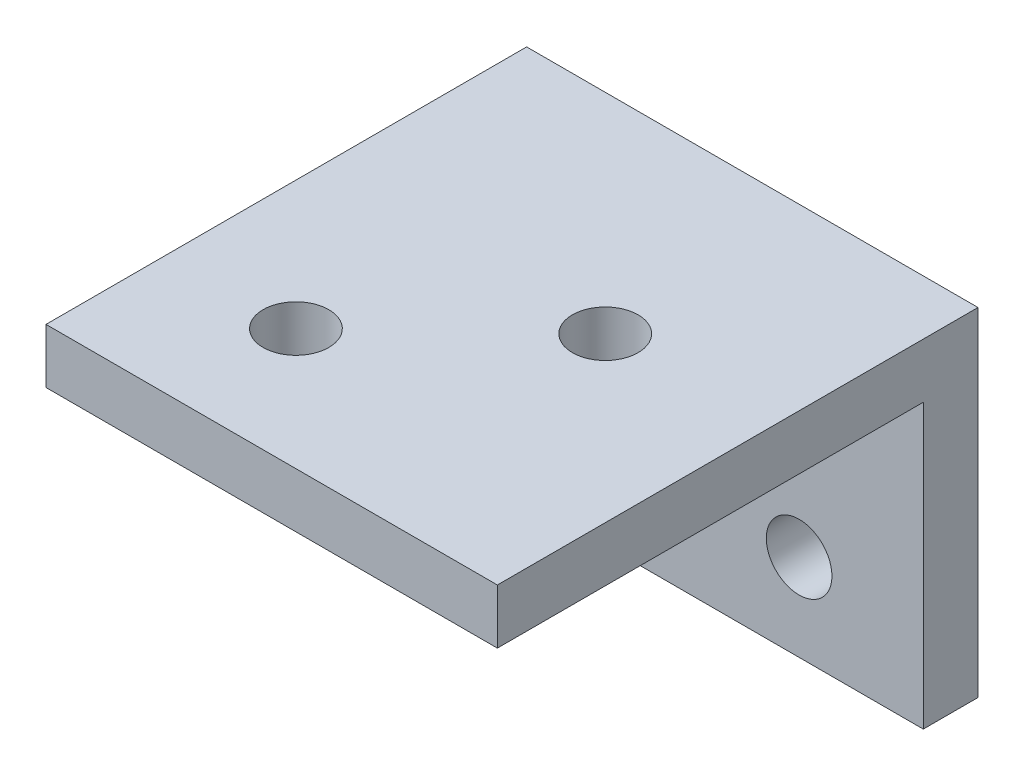
ISO-10303-21;
HEADER;
FILE_DESCRIPTION(('STEP AP214'),'2;1');
FILE_NAME('part.step','',(''),(''),'','','');
FILE_SCHEMA(('AUTOMOTIVE_DESIGN { 1 0 10303 214 1 1 1 1 }'));
ENDSEC;
DATA;
#1=APPLICATION_CONTEXT('core data for automotive mechanical design processes');
#2=APPLICATION_PROTOCOL_DEFINITION('international standard','automotive_design',2000,#1);
#3=PRODUCT_CONTEXT('',#1,'mechanical');
#4=PRODUCT('Part','Part','',(#3));
#5=PRODUCT_RELATED_PRODUCT_CATEGORY('part','',(#4));
#6=PRODUCT_DEFINITION_FORMATION('','',#4);
#7=PRODUCT_DEFINITION_CONTEXT('part definition',#1,'design');
#8=PRODUCT_DEFINITION('design','',#6,#7);
#9=PRODUCT_DEFINITION_SHAPE('','',#8);
#10=(LENGTH_UNIT() NAMED_UNIT(*) SI_UNIT(.MILLI.,.METRE.));
#11=(NAMED_UNIT(*) PLANE_ANGLE_UNIT() SI_UNIT($,.RADIAN.));
#12=(NAMED_UNIT(*) SI_UNIT($,.STERADIAN.) SOLID_ANGLE_UNIT());
#13=UNCERTAINTY_MEASURE_WITH_UNIT(LENGTH_MEASURE(1.E-05),#10,'distance_accuracy_value','');
#14=(GEOMETRIC_REPRESENTATION_CONTEXT(3) GLOBAL_UNCERTAINTY_ASSIGNED_CONTEXT((#13)) GLOBAL_UNIT_ASSIGNED_CONTEXT((#10,
#11,#12)) REPRESENTATION_CONTEXT('',''));
#15=CARTESIAN_POINT('',(0.,0.,0.));
#16=DIRECTION('',(0.,0.,1.));
#17=DIRECTION('',(1.,0.,0.));
#18=AXIS2_PLACEMENT_3D('',#15,#16,#17);
#19=CARTESIAN_POINT('',(0.,-39.1777971710205,5.));
#20=DIRECTION('',(0.,0.,-1.));
#21=DIRECTION('',(-1.,0.,0.));
#22=AXIS2_PLACEMENT_3D('',#19,#20,#21);
#23=PLANE('',#22);
#24=CARTESIAN_POINT('',(94.3666016856351,-11.6513427160121,5.));
#25=DIRECTION('',(0.,0.,-1.));
#26=DIRECTION('',(1.,0.,0.));
#27=AXIS2_PLACEMENT_3D('',#24,#25,#26);
#28=CIRCLE('',#27,2.99999999999999);
#29=CARTESIAN_POINT('',(97.3666016856351,-11.6513427160121,5.));
#30=VERTEX_POINT('',#29);
#31=EDGE_CURVE('E104',#30,#30,#28,.T.);
#32=ORIENTED_EDGE('',*,*,#31,.T.);
#33=EDGE_LOOP('',(#32));
#34=FACE_BOUND('',#33,.T.);
#35=CARTESIAN_POINT('',(75.8110207440263,-11.6513427160121,5.));
#36=DIRECTION('',(0.,0.,-1.));
#37=DIRECTION('',(1.,0.,0.));
#38=AXIS2_PLACEMENT_3D('',#35,#36,#37);
#39=CIRCLE('',#38,3.00000000000001);
#40=CARTESIAN_POINT('',(78.8110207440263,-11.6513427160121,5.));
#41=VERTEX_POINT('',#40);
#42=EDGE_CURVE('E95',#41,#41,#39,.T.);
#43=ORIENTED_EDGE('',*,*,#42,.T.);
#44=EDGE_LOOP('',(#43));
#45=FACE_BOUND('',#44,.T.);
#46=DIRECTION('',(-1.,0.,0.));
#47=VECTOR('',#46,1.);
#48=CARTESIAN_POINT('',(0.,6.28621315348603,5.));
#49=LINE('',#48,#47);
#50=CARTESIAN_POINT('',(105.717216902766,6.28621315348601,5.));
#51=VERTEX_POINT('',#50);
#52=CARTESIAN_POINT('',(64.4604055268956,6.28621315348601,5.));
#53=VERTEX_POINT('',#52);
#54=EDGE_CURVE('E143',#51,#53,#49,.T.);
#55=ORIENTED_EDGE('',*,*,#54,.T.);
#56=DIRECTION('',(0.,1.,0.));
#57=VECTOR('',#56,1.);
#58=CARTESIAN_POINT('',(64.4604055268956,-3.71378684651399,5.));
#59=LINE('',#58,#57);
#60=CARTESIAN_POINT('',(64.4604055268956,-19.5888985855102,5.));
#61=VERTEX_POINT('',#60);
#62=EDGE_CURVE('E76',#61,#53,#59,.T.);
#63=ORIENTED_EDGE('',*,*,#62,.F.);
#64=DIRECTION('',(-1.,0.,0.));
#65=VECTOR('',#64,1.);
#66=CARTESIAN_POINT('',(64.4604055268956,-19.5888985855102,5.));
#67=LINE('',#66,#65);
#68=CARTESIAN_POINT('',(105.717216902766,-19.5888985855102,5.));
#69=VERTEX_POINT('',#68);
#70=EDGE_CURVE('E74',#69,#61,#67,.T.);
#71=ORIENTED_EDGE('',*,*,#70,.F.);
#72=DIRECTION('',(0.,-1.,0.));
#73=VECTOR('',#72,1.);
#74=CARTESIAN_POINT('',(105.717216902766,-3.71378684651399,5.));
#75=LINE('',#74,#73);
#76=EDGE_CURVE('E88',#51,#69,#75,.T.);
#77=ORIENTED_EDGE('',*,*,#76,.F.);
#78=EDGE_LOOP('',(#55,#63,#71,#77));
#79=FACE_BOUND('',#78,.T.);
#80=ADVANCED_FACE('F35',(#34,#45,#79),#23,.F.);
#81=CARTESIAN_POINT('',(0.,-39.1777971710205,0.));
#82=DIRECTION('',(0.,0.,-1.));
#83=DIRECTION('',(-1.,0.,0.));
#84=AXIS2_PLACEMENT_3D('',#81,#82,#83);
#85=PLANE('',#84);
#86=CARTESIAN_POINT('',(75.8110207440263,-11.6513427160121,0.));
#87=DIRECTION('',(0.,0.,-1.));
#88=DIRECTION('',(1.,0.,0.));
#89=AXIS2_PLACEMENT_3D('',#86,#87,#88);
#90=CIRCLE('',#89,3.00000000000001);
#91=CARTESIAN_POINT('',(78.8110207440263,-11.6513427160121,0.));
#92=VERTEX_POINT('',#91);
#93=EDGE_CURVE('E101',#92,#92,#90,.T.);
#94=ORIENTED_EDGE('',*,*,#93,.F.);
#95=EDGE_LOOP('',(#94));
#96=FACE_BOUND('',#95,.T.);
#97=DIRECTION('',(0.,-1.,0.));
#98=VECTOR('',#97,1.);
#99=CARTESIAN_POINT('',(105.717216902766,-3.71378684651399,0.));
#100=LINE('',#99,#98);
#101=CARTESIAN_POINT('',(105.717216902766,11.286213153486,0.));
#102=VERTEX_POINT('',#101);
#103=CARTESIAN_POINT('',(105.717216902766,-19.5888985855102,0.));
#104=VERTEX_POINT('',#103);
#105=EDGE_CURVE('E93',#102,#104,#100,.T.);
#106=ORIENTED_EDGE('',*,*,#105,.T.);
#107=DIRECTION('',(-1.,0.,0.));
#108=VECTOR('',#107,1.);
#109=CARTESIAN_POINT('',(64.4604055268956,-19.5888985855102,0.));
#110=LINE('',#109,#108);
#111=CARTESIAN_POINT('',(64.4604055268956,-19.5888985855102,0.));
#112=VERTEX_POINT('',#111);
#113=EDGE_CURVE('E71',#104,#112,#110,.T.);
#114=ORIENTED_EDGE('',*,*,#113,.T.);
#115=DIRECTION('',(0.,1.,0.));
#116=VECTOR('',#115,1.);
#117=CARTESIAN_POINT('',(64.4604055268956,-3.71378684651399,0.));
#118=LINE('',#117,#116);
#119=CARTESIAN_POINT('',(64.4604055268956,11.286213153486,0.));
#120=VERTEX_POINT('',#119);
#121=EDGE_CURVE('E79',#112,#120,#118,.T.);
#122=ORIENTED_EDGE('',*,*,#121,.T.);
#123=DIRECTION('',(1.,0.,0.));
#124=VECTOR('',#123,1.);
#125=CARTESIAN_POINT('',(64.4604055268956,11.286213153486,0.));
#126=LINE('',#125,#124);
#127=EDGE_CURVE('E114',#120,#102,#126,.T.);
#128=ORIENTED_EDGE('',*,*,#127,.T.);
#129=EDGE_LOOP('',(#106,#114,#122,#128));
#130=FACE_BOUND('',#129,.T.);
#131=CARTESIAN_POINT('',(94.3666016856351,-11.6513427160121,0.));
#132=DIRECTION('',(0.,0.,-1.));
#133=DIRECTION('',(1.,0.,0.));
#134=AXIS2_PLACEMENT_3D('',#131,#132,#133);
#135=CIRCLE('',#134,2.99999999999999);
#136=CARTESIAN_POINT('',(97.3666016856351,-11.6513427160121,0.));
#137=VERTEX_POINT('',#136);
#138=EDGE_CURVE('E107',#137,#137,#135,.T.);
#139=ORIENTED_EDGE('',*,*,#138,.F.);
#140=EDGE_LOOP('',(#139));
#141=FACE_BOUND('',#140,.T.);
#142=ADVANCED_FACE('F90',(#96,#130,#141),#85,.T.);
#143=CARTESIAN_POINT('',(105.717216902766,-3.71378684651399,5.));
#144=DIRECTION('',(-1.,0.,0.));
#145=DIRECTION('',(0.,0.,1.));
#146=AXIS2_PLACEMENT_3D('',#143,#144,#145);
#147=PLANE('',#146);
#148=ORIENTED_EDGE('',*,*,#105,.F.);
#149=DIRECTION('',(0.,0.,1.));
#150=VECTOR('',#149,1.);
#151=CARTESIAN_POINT('',(105.717216902766,11.286213153486,0.));
#152=LINE('',#151,#150);
#153=CARTESIAN_POINT('',(105.717216902766,11.286213153486,43.9312426131457));
#154=VERTEX_POINT('',#153);
#155=EDGE_CURVE('E110',#102,#154,#152,.T.);
#156=ORIENTED_EDGE('',*,*,#155,.T.);
#157=DIRECTION('',(0.,1.,0.));
#158=VECTOR('',#157,1.);
#159=CARTESIAN_POINT('',(105.717216902766,6.28621315348601,43.9312426131457));
#160=LINE('',#159,#158);
#161=CARTESIAN_POINT('',(105.717216902766,6.28621315348601,43.9312426131457));
#162=VERTEX_POINT('',#161);
#163=EDGE_CURVE('E119',#162,#154,#160,.T.);
#164=ORIENTED_EDGE('',*,*,#163,.F.);
#165=DIRECTION('',(0.,0.,1.));
#166=VECTOR('',#165,1.);
#167=CARTESIAN_POINT('',(105.717216902766,6.28621315348601,0.));
#168=LINE('',#167,#166);
#169=EDGE_CURVE('E50',#51,#162,#168,.T.);
#170=ORIENTED_EDGE('',*,*,#169,.F.);
#171=ORIENTED_EDGE('',*,*,#76,.T.);
#172=DIRECTION('',(0.,0.,-1.));
#173=VECTOR('',#172,1.);
#174=CARTESIAN_POINT('',(105.717216902766,-19.5888985855102,5.));
#175=LINE('',#174,#173);
#176=EDGE_CURVE('E11',#69,#104,#175,.T.);
#177=ORIENTED_EDGE('',*,*,#176,.T.);
#178=EDGE_LOOP('',(#148,#156,#164,#170,#171,#177));
#179=FACE_BOUND('',#178,.T.);
#180=ADVANCED_FACE('F37',(#179),#147,.F.);
#181=CARTESIAN_POINT('',(64.4604055268956,-19.5888985855102,5.));
#182=DIRECTION('',(0.,1.,0.));
#183=DIRECTION('',(1.,0.,0.));
#184=AXIS2_PLACEMENT_3D('',#181,#182,#183);
#185=PLANE('',#184);
#186=ORIENTED_EDGE('',*,*,#113,.F.);
#187=ORIENTED_EDGE('',*,*,#176,.F.);
#188=ORIENTED_EDGE('',*,*,#70,.T.);
#189=DIRECTION('',(0.,0.,-1.));
#190=VECTOR('',#189,1.);
#191=CARTESIAN_POINT('',(64.4604055268956,-19.5888985855102,5.));
#192=LINE('',#191,#190);
#193=EDGE_CURVE('E43',#61,#112,#192,.T.);
#194=ORIENTED_EDGE('',*,*,#193,.T.);
#195=EDGE_LOOP('',(#186,#187,#188,#194));
#196=FACE_BOUND('',#195,.T.);
#197=ADVANCED_FACE('F69',(#196),#185,.F.);
#198=CARTESIAN_POINT('',(64.4604055268956,-3.71378684651399,5.));
#199=DIRECTION('',(1.,0.,0.));
#200=DIRECTION('',(0.,0.,-1.));
#201=AXIS2_PLACEMENT_3D('',#198,#199,#200);
#202=PLANE('',#201);
#203=ORIENTED_EDGE('',*,*,#121,.F.);
#204=ORIENTED_EDGE('',*,*,#193,.F.);
#205=ORIENTED_EDGE('',*,*,#62,.T.);
#206=DIRECTION('',(0.,0.,1.));
#207=VECTOR('',#206,1.);
#208=CARTESIAN_POINT('',(64.4604055268956,6.28621315348601,0.));
#209=LINE('',#208,#207);
#210=CARTESIAN_POINT('',(64.4604055268956,6.28621315348601,43.9312426131457));
#211=VERTEX_POINT('',#210);
#212=EDGE_CURVE('E127',#53,#211,#209,.T.);
#213=ORIENTED_EDGE('',*,*,#212,.T.);
#214=DIRECTION('',(0.,1.,0.));
#215=VECTOR('',#214,1.);
#216=CARTESIAN_POINT('',(64.4604055268956,6.28621315348601,43.9312426131457));
#217=LINE('',#216,#215);
#218=CARTESIAN_POINT('',(64.4604055268956,11.286213153486,43.9312426131457));
#219=VERTEX_POINT('',#218);
#220=EDGE_CURVE('E118',#211,#219,#217,.T.);
#221=ORIENTED_EDGE('',*,*,#220,.T.);
#222=DIRECTION('',(0.,0.,1.));
#223=VECTOR('',#222,1.);
#224=CARTESIAN_POINT('',(64.4604055268956,11.286213153486,0.));
#225=LINE('',#224,#223);
#226=EDGE_CURVE('E84',#120,#219,#225,.T.);
#227=ORIENTED_EDGE('',*,*,#226,.F.);
#228=EDGE_LOOP('',(#203,#204,#205,#213,#221,#227));
#229=FACE_BOUND('',#228,.T.);
#230=ADVANCED_FACE('F80',(#229),#202,.F.);
#231=CARTESIAN_POINT('',(75.8110207440263,-11.6513427160121,5.));
#232=DIRECTION('',(0.,0.,-1.));
#233=DIRECTION('',(-1.,0.,0.));
#234=AXIS2_PLACEMENT_3D('',#231,#232,#233);
#235=CYLINDRICAL_SURFACE('',#234,3.00000000000001);
#236=ORIENTED_EDGE('',*,*,#42,.F.);
#237=EDGE_LOOP('',(#236));
#238=FACE_BOUND('',#237,.T.);
#239=ORIENTED_EDGE('',*,*,#93,.T.);
#240=EDGE_LOOP('',(#239));
#241=FACE_BOUND('',#240,.T.);
#242=ADVANCED_FACE('F181',(#238,#241),#235,.F.);
#243=CARTESIAN_POINT('',(94.3666016856351,-11.6513427160121,5.));
#244=DIRECTION('',(0.,0.,-1.));
#245=DIRECTION('',(-1.,0.,0.));
#246=AXIS2_PLACEMENT_3D('',#243,#244,#245);
#247=CYLINDRICAL_SURFACE('',#246,2.99999999999999);
#248=ORIENTED_EDGE('',*,*,#31,.F.);
#249=EDGE_LOOP('',(#248));
#250=FACE_BOUND('',#249,.T.);
#251=ORIENTED_EDGE('',*,*,#138,.T.);
#252=EDGE_LOOP('',(#251));
#253=FACE_BOUND('',#252,.T.);
#254=ADVANCED_FACE('F238',(#250,#253),#247,.F.);
#255=CARTESIAN_POINT('',(64.4604055268956,11.286213153486,0.));
#256=DIRECTION('',(0.,1.,0.));
#257=DIRECTION('',(0.,0.,-1.));
#258=AXIS2_PLACEMENT_3D('',#255,#256,#257);
#259=PLANE('',#258);
#260=ORIENTED_EDGE('',*,*,#155,.F.);
#261=ORIENTED_EDGE('',*,*,#127,.F.);
#262=ORIENTED_EDGE('',*,*,#226,.T.);
#263=DIRECTION('',(-1.,0.,0.));
#264=VECTOR('',#263,1.);
#265=CARTESIAN_POINT('',(0.,11.286213153486,43.9312426131457));
#266=LINE('',#265,#264);
#267=EDGE_CURVE('E131',#154,#219,#266,.T.);
#268=ORIENTED_EDGE('',*,*,#267,.F.);
#269=EDGE_LOOP('',(#260,#261,#262,#268));
#270=FACE_BOUND('',#269,.T.);
#271=CARTESIAN_POINT('',(76.2138487255198,11.286213153486,32.8403188736275));
#272=DIRECTION('',(0.,-1.,0.));
#273=DIRECTION('',(0.,0.,-1.));
#274=AXIS2_PLACEMENT_3D('',#271,#272,#273);
#275=CIRCLE('',#274,3.00000000000001);
#276=CARTESIAN_POINT('',(76.2138487255198,11.286213153486,29.8403188736275));
#277=VERTEX_POINT('',#276);
#278=EDGE_CURVE('E128',#277,#277,#275,.T.);
#279=ORIENTED_EDGE('',*,*,#278,.T.);
#280=EDGE_LOOP('',(#279));
#281=FACE_BOUND('',#280,.T.);
#282=CARTESIAN_POINT('',(90.7600106173783,11.286213153486,19.1140967343846));
#283=DIRECTION('',(0.,-1.,0.));
#284=DIRECTION('',(0.,0.,-1.));
#285=AXIS2_PLACEMENT_3D('',#282,#283,#284);
#286=CIRCLE('',#285,3.00000000000001);
#287=CARTESIAN_POINT('',(90.7600106173783,11.286213153486,16.1140967343846));
#288=VERTEX_POINT('',#287);
#289=EDGE_CURVE('E124',#288,#288,#286,.F.);
#290=ORIENTED_EDGE('',*,*,#289,.F.);
#291=EDGE_LOOP('',(#290));
#292=FACE_BOUND('',#291,.T.);
#293=ADVANCED_FACE('F168',(#270,#281,#292),#259,.T.);
#294=CARTESIAN_POINT('',(0.,6.28621315348603,43.9312426131457));
#295=DIRECTION('',(0.,0.,1.));
#296=DIRECTION('',(1.,0.,0.));
#297=AXIS2_PLACEMENT_3D('',#294,#295,#296);
#298=PLANE('',#297);
#299=ORIENTED_EDGE('',*,*,#267,.T.);
#300=ORIENTED_EDGE('',*,*,#220,.F.);
#301=DIRECTION('',(-1.,0.,0.));
#302=VECTOR('',#301,1.);
#303=CARTESIAN_POINT('',(0.,6.28621315348603,43.9312426131457));
#304=LINE('',#303,#302);
#305=EDGE_CURVE('E139',#162,#211,#304,.T.);
#306=ORIENTED_EDGE('',*,*,#305,.F.);
#307=ORIENTED_EDGE('',*,*,#163,.T.);
#308=EDGE_LOOP('',(#299,#300,#306,#307));
#309=FACE_BOUND('',#308,.T.);
#310=ADVANCED_FACE('F253',(#309),#298,.T.);
#311=CARTESIAN_POINT('',(76.2138487255198,6.28621315348601,32.8403188736275));
#312=DIRECTION('',(0.,1.,0.));
#313=DIRECTION('',(0.,0.,-1.));
#314=AXIS2_PLACEMENT_3D('',#311,#312,#313);
#315=CYLINDRICAL_SURFACE('',#314,3.00000000000001);
#316=CARTESIAN_POINT('',(76.2138487255198,6.28621315348601,32.8403188736275));
#317=DIRECTION('',(0.,-1.,0.));
#318=DIRECTION('',(0.,0.,-1.));
#319=AXIS2_PLACEMENT_3D('',#316,#317,#318);
#320=CIRCLE('',#319,3.00000000000001);
#321=CARTESIAN_POINT('',(76.2138487255198,6.28621315348601,29.8403188736275));
#322=VERTEX_POINT('',#321);
#323=EDGE_CURVE('E136',#322,#322,#320,.T.);
#324=ORIENTED_EDGE('',*,*,#323,.T.);
#325=EDGE_LOOP('',(#324));
#326=FACE_BOUND('',#325,.T.);
#327=ORIENTED_EDGE('',*,*,#278,.F.);
#328=EDGE_LOOP('',(#327));
#329=FACE_BOUND('',#328,.T.);
#330=ADVANCED_FACE('F267',(#326,#329),#315,.F.);
#331=CARTESIAN_POINT('',(90.7600106173783,6.28621315348601,19.1140967343846));
#332=DIRECTION('',(0.,1.,0.));
#333=DIRECTION('',(0.,0.,-1.));
#334=AXIS2_PLACEMENT_3D('',#331,#332,#333);
#335=CYLINDRICAL_SURFACE('',#334,3.00000000000001);
#336=CARTESIAN_POINT('',(90.7600106173783,6.28621315348601,19.1140967343846));
#337=DIRECTION('',(0.,-1.,0.));
#338=DIRECTION('',(0.,0.,-1.));
#339=AXIS2_PLACEMENT_3D('',#336,#337,#338);
#340=CIRCLE('',#339,3.00000000000001);
#341=CARTESIAN_POINT('',(90.7600106173783,6.28621315348601,16.1140967343846));
#342=VERTEX_POINT('',#341);
#343=EDGE_CURVE('E122',#342,#342,#340,.F.);
#344=ORIENTED_EDGE('',*,*,#343,.F.);
#345=EDGE_LOOP('',(#344));
#346=FACE_BOUND('',#345,.T.);
#347=ORIENTED_EDGE('',*,*,#289,.T.);
#348=EDGE_LOOP('',(#347));
#349=FACE_BOUND('',#348,.T.);
#350=ADVANCED_FACE('F276',(#346,#349),#335,.F.);
#351=CARTESIAN_POINT('',(0.,6.28621315348603,0.));
#352=DIRECTION('',(0.,1.,0.));
#353=DIRECTION('',(0.,0.,-1.));
#354=AXIS2_PLACEMENT_3D('',#351,#352,#353);
#355=PLANE('',#354);
#356=ORIENTED_EDGE('',*,*,#212,.F.);
#357=ORIENTED_EDGE('',*,*,#54,.F.);
#358=ORIENTED_EDGE('',*,*,#169,.T.);
#359=ORIENTED_EDGE('',*,*,#305,.T.);
#360=EDGE_LOOP('',(#356,#357,#358,#359));
#361=FACE_BOUND('',#360,.T.);
#362=ORIENTED_EDGE('',*,*,#323,.F.);
#363=EDGE_LOOP('',(#362));
#364=FACE_BOUND('',#363,.T.);
#365=ORIENTED_EDGE('',*,*,#343,.T.);
#366=EDGE_LOOP('',(#365));
#367=FACE_BOUND('',#366,.T.);
#368=ADVANCED_FACE('F156',(#361,#364,#367),#355,.F.);
#369=CLOSED_SHELL('',(#80,#142,#180,#197,#230,#242,#254,#293,#310,#330,#350,#368));
#370=MANIFOLD_SOLID_BREP('B2',#369);
#371=ADVANCED_BREP_SHAPE_REPRESENTATION('',(#18,#370),#14);
#372=SHAPE_DEFINITION_REPRESENTATION(#9,#371);
ENDSEC;
END-ISO-10303-21;
